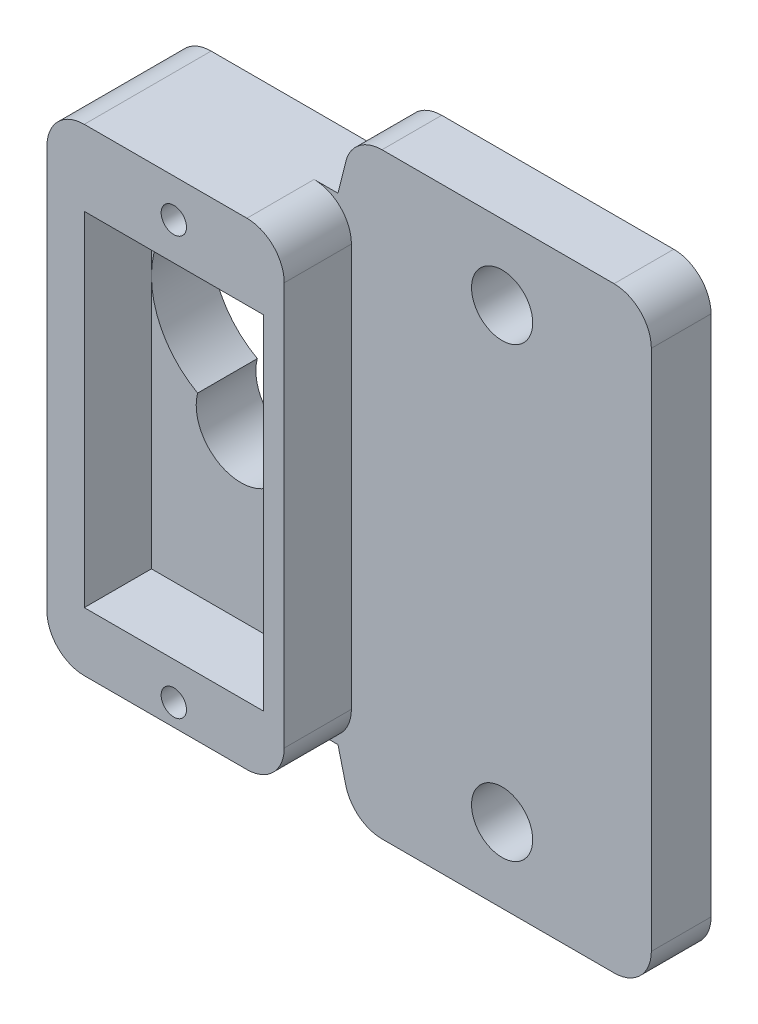
ISO-10303-21;
HEADER;
FILE_DESCRIPTION(('STEP AP214'),'2;1');
FILE_NAME('part.step','',(''),(''),'','','');
FILE_SCHEMA(('AUTOMOTIVE_DESIGN { 1 0 10303 214 1 1 1 1 }'));
ENDSEC;
DATA;
#1=APPLICATION_CONTEXT('core data for automotive mechanical design processes');
#2=APPLICATION_PROTOCOL_DEFINITION('international standard','automotive_design',2000,#1);
#3=PRODUCT_CONTEXT('',#1,'mechanical');
#4=PRODUCT('Part','Part','',(#3));
#5=PRODUCT_RELATED_PRODUCT_CATEGORY('part','',(#4));
#6=PRODUCT_DEFINITION_FORMATION('','',#4);
#7=PRODUCT_DEFINITION_CONTEXT('part definition',#1,'design');
#8=PRODUCT_DEFINITION('design','',#6,#7);
#9=PRODUCT_DEFINITION_SHAPE('','',#8);
#10=(LENGTH_UNIT() NAMED_UNIT(*) SI_UNIT(.MILLI.,.METRE.));
#11=(NAMED_UNIT(*) PLANE_ANGLE_UNIT() SI_UNIT($,.RADIAN.));
#12=(NAMED_UNIT(*) SI_UNIT($,.STERADIAN.) SOLID_ANGLE_UNIT());
#13=UNCERTAINTY_MEASURE_WITH_UNIT(LENGTH_MEASURE(1.E-05),#10,'distance_accuracy_value','');
#14=(GEOMETRIC_REPRESENTATION_CONTEXT(3) GLOBAL_UNCERTAINTY_ASSIGNED_CONTEXT((#13)) GLOBAL_UNIT_ASSIGNED_CONTEXT((#10,
#11,#12)) REPRESENTATION_CONTEXT('',''));
#15=CARTESIAN_POINT('',(0.,0.,0.));
#16=DIRECTION('',(0.,0.,1.));
#17=DIRECTION('',(1.,0.,0.));
#18=AXIS2_PLACEMENT_3D('',#15,#16,#17);
#19=CARTESIAN_POINT('',(0.,0.,4.));
#20=DIRECTION('',(0.,0.,1.));
#21=DIRECTION('',(1.,0.,0.));
#22=AXIS2_PLACEMENT_3D('',#19,#20,#21);
#23=PLANE('',#22);
#24=CARTESIAN_POINT('',(-7.5,4.95,4.));
#25=DIRECTION('',(0.,0.,1.));
#26=DIRECTION('',(1.,0.,0.));
#27=AXIS2_PLACEMENT_3D('',#24,#25,#26);
#28=CIRCLE('',#27,6.);
#29=CARTESIAN_POINT('',(-7.5,10.95,4.));
#30=VERTEX_POINT('',#29);
#31=CARTESIAN_POINT('',(-1.5,4.95,4.));
#32=VERTEX_POINT('',#31);
#33=EDGE_CURVE('E855',#30,#32,#28,.F.);
#34=ORIENTED_EDGE('',*,*,#33,.T.);
#35=DIRECTION('',(0.,1.,0.));
#36=VECTOR('',#35,1.);
#37=CARTESIAN_POINT('',(-1.5,0.,4.));
#38=LINE('',#37,#36);
#39=CARTESIAN_POINT('',(-1.5,10.95,4.));
#40=VERTEX_POINT('',#39);
#41=EDGE_CURVE('E326',#32,#40,#38,.T.);
#42=ORIENTED_EDGE('',*,*,#41,.T.);
#43=DIRECTION('',(-1.,0.,0.));
#44=VECTOR('',#43,1.);
#45=CARTESIAN_POINT('',(0.,10.95,4.));
#46=LINE('',#45,#44);
#47=EDGE_CURVE('E428',#40,#30,#46,.T.);
#48=ORIENTED_EDGE('',*,*,#47,.T.);
#49=EDGE_LOOP('',(#34,#42,#48));
#50=FACE_BOUND('',#49,.T.);
#51=ADVANCED_FACE('F37',(#50),#23,.T.);
#52=CARTESIAN_POINT('',(-13.5,4.95,4.));
#53=VERTEX_POINT('',#52);
#54=EDGE_CURVE('E255',#53,#30,#28,.F.);
#55=ORIENTED_EDGE('',*,*,#54,.T.);
#56=CARTESIAN_POINT('',(-13.5,10.95,4.));
#57=VERTEX_POINT('',#56);
#58=EDGE_CURVE('E447',#30,#57,#46,.T.);
#59=ORIENTED_EDGE('',*,*,#58,.T.);
#60=DIRECTION('',(0.,1.,0.));
#61=VECTOR('',#60,1.);
#62=CARTESIAN_POINT('',(-13.5,0.,4.));
#63=LINE('',#62,#61);
#64=EDGE_CURVE('E319',#53,#57,#63,.T.);
#65=ORIENTED_EDGE('',*,*,#64,.F.);
#66=EDGE_LOOP('',(#55,#59,#65));
#67=FACE_BOUND('',#66,.T.);
#68=ADVANCED_FACE('F509',(#67),#23,.T.);
#69=CARTESIAN_POINT('',(10.,-15.,4.));
#70=DIRECTION('',(0.,0.,1.));
#71=DIRECTION('',(1.,0.,0.));
#72=AXIS2_PLACEMENT_3D('',#69,#70,#71);
#73=CIRCLE('',#72,2.05);
#74=CARTESIAN_POINT('',(12.05,-15.,4.));
#75=VERTEX_POINT('',#74);
#76=EDGE_CURVE('E276',#75,#75,#73,.F.);
#77=ORIENTED_EDGE('',*,*,#76,.T.);
#78=EDGE_LOOP('',(#77));
#79=FACE_BOUND('',#78,.T.);
#80=CARTESIAN_POINT('',(10.,15.,4.));
#81=DIRECTION('',(0.,0.,1.));
#82=DIRECTION('',(1.,0.,0.));
#83=AXIS2_PLACEMENT_3D('',#80,#81,#82);
#84=CIRCLE('',#83,2.05);
#85=CARTESIAN_POINT('',(12.05,15.,4.));
#86=VERTEX_POINT('',#85);
#87=EDGE_CURVE('E273',#86,#86,#84,.T.);
#88=ORIENTED_EDGE('',*,*,#87,.F.);
#89=EDGE_LOOP('',(#88));
#90=FACE_BOUND('',#89,.T.);
#91=DIRECTION('',(1.,0.,0.));
#92=VECTOR('',#91,1.);
#93=CARTESIAN_POINT('',(0.,20.,4.));
#94=LINE('',#93,#92);
#95=CARTESIAN_POINT('',(1.95194101601104,20.,4.));
#96=VERTEX_POINT('',#95);
#97=CARTESIAN_POINT('',(17.5,20.,4.));
#98=VERTEX_POINT('',#97);
#99=EDGE_CURVE('E263',#96,#98,#94,.T.);
#100=ORIENTED_EDGE('',*,*,#99,.F.);
#101=CARTESIAN_POINT('',(1.95194101601104,17.5,4.));
#102=DIRECTION('',(0.,0.,1.));
#103=DIRECTION('',(1.,0.,0.));
#104=AXIS2_PLACEMENT_3D('',#101,#102,#103);
#105=CIRCLE('',#104,2.5);
#106=CARTESIAN_POINT('',(-0.47341523435229,18.1063390625908,4.));
#107=VERTEX_POINT('',#106);
#108=EDGE_CURVE('E349',#96,#107,#105,.T.);
#109=ORIENTED_EDGE('',*,*,#108,.T.);
#110=DIRECTION('',(-0.242535625036332,-0.970142500145332,0.));
#111=VECTOR('',#110,1.);
#112=CARTESIAN_POINT('',(-4.70588235294116,1.17647058823529,4.));
#113=LINE('',#112,#111);
#114=CARTESIAN_POINT('',(-0.999999999999996,16.,4.));
#115=VERTEX_POINT('',#114);
#116=EDGE_CURVE('E266',#107,#115,#113,.T.);
#117=ORIENTED_EDGE('',*,*,#116,.T.);
#118=DIRECTION('',(-1.,0.,0.));
#119=VECTOR('',#118,1.);
#120=CARTESIAN_POINT('',(0.,16.,4.));
#121=LINE('',#120,#119);
#122=CARTESIAN_POINT('',(-2.60000000000001,16.,4.));
#123=VERTEX_POINT('',#122);
#124=EDGE_CURVE('E268',#115,#123,#121,.T.);
#125=ORIENTED_EDGE('',*,*,#124,.T.);
#126=CARTESIAN_POINT('',(-2.6,13.5,4.));
#127=DIRECTION('',(0.,0.,1.));
#128=DIRECTION('',(1.,0.,0.));
#129=AXIS2_PLACEMENT_3D('',#126,#127,#128);
#130=CIRCLE('',#129,2.5);
#131=CARTESIAN_POINT('',(-0.100000000000005,13.5,4.));
#132=VERTEX_POINT('',#131);
#133=EDGE_CURVE('E410',#132,#123,#130,.T.);
#134=ORIENTED_EDGE('',*,*,#133,.F.);
#135=DIRECTION('',(0.,-1.,0.));
#136=VECTOR('',#135,1.);
#137=CARTESIAN_POINT('',(-0.100000000000003,0.,4.));
#138=LINE('',#137,#136);
#139=CARTESIAN_POINT('',(-0.100000000000001,-13.5,4.));
#140=VERTEX_POINT('',#139);
#141=EDGE_CURVE('E413',#132,#140,#138,.T.);
#142=ORIENTED_EDGE('',*,*,#141,.T.);
#143=CARTESIAN_POINT('',(-2.6,-13.5,4.));
#144=DIRECTION('',(0.,0.,1.));
#145=DIRECTION('',(1.,0.,0.));
#146=AXIS2_PLACEMENT_3D('',#143,#144,#145);
#147=CIRCLE('',#146,2.5);
#148=CARTESIAN_POINT('',(-2.6,-16.,4.));
#149=VERTEX_POINT('',#148);
#150=EDGE_CURVE('E233',#140,#149,#147,.F.);
#151=ORIENTED_EDGE('',*,*,#150,.T.);
#152=DIRECTION('',(-1.,0.,0.));
#153=VECTOR('',#152,1.);
#154=CARTESIAN_POINT('',(0.,-16.,4.));
#155=LINE('',#154,#153);
#156=CARTESIAN_POINT('',(-0.999999999999996,-16.,4.));
#157=VERTEX_POINT('',#156);
#158=EDGE_CURVE('E270',#157,#149,#155,.T.);
#159=ORIENTED_EDGE('',*,*,#158,.F.);
#160=DIRECTION('',(-0.242535625036332,0.970142500145332,0.));
#161=VECTOR('',#160,1.);
#162=CARTESIAN_POINT('',(-4.70588235294116,-1.17647058823529,4.));
#163=LINE('',#162,#161);
#164=CARTESIAN_POINT('',(-0.47341523435229,-18.1063390625908,4.));
#165=VERTEX_POINT('',#164);
#166=EDGE_CURVE('E254',#165,#157,#163,.T.);
#167=ORIENTED_EDGE('',*,*,#166,.F.);
#168=CARTESIAN_POINT('',(1.95194101601104,-17.5,4.));
#169=DIRECTION('',(0.,0.,1.));
#170=DIRECTION('',(1.,0.,0.));
#171=AXIS2_PLACEMENT_3D('',#168,#169,#170);
#172=CIRCLE('',#171,2.5);
#173=CARTESIAN_POINT('',(1.95194101601104,-20.,4.));
#174=VERTEX_POINT('',#173);
#175=EDGE_CURVE('E347',#165,#174,#172,.T.);
#176=ORIENTED_EDGE('',*,*,#175,.T.);
#177=DIRECTION('',(-1.,0.,0.));
#178=VECTOR('',#177,1.);
#179=CARTESIAN_POINT('',(0.,-20.,4.));
#180=LINE('',#179,#178);
#181=CARTESIAN_POINT('',(17.5,-20.,4.));
#182=VERTEX_POINT('',#181);
#183=EDGE_CURVE('E257',#182,#174,#180,.T.);
#184=ORIENTED_EDGE('',*,*,#183,.F.);
#185=CARTESIAN_POINT('',(17.5,-17.5,4.));
#186=DIRECTION('',(0.,0.,1.));
#187=DIRECTION('',(1.,0.,0.));
#188=AXIS2_PLACEMENT_3D('',#185,#186,#187);
#189=CIRCLE('',#188,2.5);
#190=CARTESIAN_POINT('',(20.,-17.5,4.));
#191=VERTEX_POINT('',#190);
#192=EDGE_CURVE('E343',#182,#191,#189,.T.);
#193=ORIENTED_EDGE('',*,*,#192,.T.);
#194=DIRECTION('',(0.,-1.,0.));
#195=VECTOR('',#194,1.);
#196=CARTESIAN_POINT('',(20.,0.,4.));
#197=LINE('',#196,#195);
#198=CARTESIAN_POINT('',(20.,17.5,4.));
#199=VERTEX_POINT('',#198);
#200=EDGE_CURVE('E260',#199,#191,#197,.T.);
#201=ORIENTED_EDGE('',*,*,#200,.F.);
#202=CARTESIAN_POINT('',(17.5,17.5,4.));
#203=DIRECTION('',(0.,0.,1.));
#204=DIRECTION('',(1.,0.,0.));
#205=AXIS2_PLACEMENT_3D('',#202,#203,#204);
#206=CIRCLE('',#205,2.5);
#207=EDGE_CURVE('E345',#199,#98,#206,.T.);
#208=ORIENTED_EDGE('',*,*,#207,.T.);
#209=EDGE_LOOP('',(#100,#109,#117,#125,#134,#142,#151,#159,#167,#176,#184,#193,#201,#208));
#210=FACE_BOUND('',#209,.T.);
#211=ADVANCED_FACE('F394',(#79,#90,#210),#23,.T.);
#212=CARTESIAN_POINT('',(-4.70588235294116,-1.17647058823529,4.));
#213=DIRECTION('',(-0.970142500145332,-0.242535625036332,0.));
#214=DIRECTION('',(0.242535625036332,-0.970142500145332,0.));
#215=AXIS2_PLACEMENT_3D('',#212,#213,#214);
#216=PLANE('',#215);
#217=DIRECTION('',(-0.242535625036332,0.970142500145332,0.));
#218=VECTOR('',#217,1.);
#219=CARTESIAN_POINT('',(-4.70588235294116,-1.17647058823529,0.));
#220=LINE('',#219,#218);
#221=CARTESIAN_POINT('',(-0.47341523435229,-18.1063390625908,0.));
#222=VERTEX_POINT('',#221);
#223=CARTESIAN_POINT('',(-0.999999999999996,-16.,0.));
#224=VERTEX_POINT('',#223);
#225=EDGE_CURVE('E287',#222,#224,#220,.T.);
#226=ORIENTED_EDGE('',*,*,#225,.F.);
#227=DIRECTION('',(0.,0.,-1.));
#228=VECTOR('',#227,1.);
#229=CARTESIAN_POINT('',(-0.473415234352291,-18.1063390625908,4.));
#230=LINE('',#229,#228);
#231=EDGE_CURVE('E356',#222,#165,#230,.F.);
#232=ORIENTED_EDGE('',*,*,#231,.T.);
#233=ORIENTED_EDGE('',*,*,#166,.T.);
#234=DIRECTION('',(0.,0.,-1.));
#235=VECTOR('',#234,1.);
#236=CARTESIAN_POINT('',(-0.999999999999996,-16.,4.));
#237=LINE('',#236,#235);
#238=EDGE_CURVE('E312',#157,#224,#237,.T.);
#239=ORIENTED_EDGE('',*,*,#238,.T.);
#240=EDGE_LOOP('',(#226,#232,#233,#239));
#241=FACE_BOUND('',#240,.T.);
#242=ADVANCED_FACE('F529',(#241),#216,.T.);
#243=CARTESIAN_POINT('',(0.,-20.,4.));
#244=DIRECTION('',(0.,-1.,0.));
#245=DIRECTION('',(0.,0.,-1.));
#246=AXIS2_PLACEMENT_3D('',#243,#244,#245);
#247=PLANE('',#246);
#248=ORIENTED_EDGE('',*,*,#183,.T.);
#249=DIRECTION('',(0.,0.,-1.));
#250=VECTOR('',#249,1.);
#251=CARTESIAN_POINT('',(1.95194101601104,-20.,4.));
#252=LINE('',#251,#250);
#253=CARTESIAN_POINT('',(1.95194101601104,-20.,0.));
#254=VERTEX_POINT('',#253);
#255=EDGE_CURVE('E353',#174,#254,#252,.T.);
#256=ORIENTED_EDGE('',*,*,#255,.T.);
#257=DIRECTION('',(-1.,0.,0.));
#258=VECTOR('',#257,1.);
#259=CARTESIAN_POINT('',(0.,-20.,0.));
#260=LINE('',#259,#258);
#261=CARTESIAN_POINT('',(17.5,-20.,0.));
#262=VERTEX_POINT('',#261);
#263=EDGE_CURVE('E289',#262,#254,#260,.T.);
#264=ORIENTED_EDGE('',*,*,#263,.F.);
#265=DIRECTION('',(0.,0.,-1.));
#266=VECTOR('',#265,1.);
#267=CARTESIAN_POINT('',(17.5,-20.,4.));
#268=LINE('',#267,#266);
#269=EDGE_CURVE('E351',#262,#182,#268,.F.);
#270=ORIENTED_EDGE('',*,*,#269,.T.);
#271=EDGE_LOOP('',(#248,#256,#264,#270));
#272=FACE_BOUND('',#271,.T.);
#273=ADVANCED_FACE('F534',(#272),#247,.T.);
#274=CARTESIAN_POINT('',(20.,0.,4.));
#275=DIRECTION('',(1.,0.,0.));
#276=DIRECTION('',(0.,0.,-1.));
#277=AXIS2_PLACEMENT_3D('',#274,#275,#276);
#278=PLANE('',#277);
#279=DIRECTION('',(0.,-1.,0.));
#280=VECTOR('',#279,1.);
#281=CARTESIAN_POINT('',(20.,0.,0.));
#282=LINE('',#281,#280);
#283=CARTESIAN_POINT('',(20.,17.5,0.));
#284=VERTEX_POINT('',#283);
#285=CARTESIAN_POINT('',(20.,-17.5,0.));
#286=VERTEX_POINT('',#285);
#287=EDGE_CURVE('E292',#284,#286,#282,.T.);
#288=ORIENTED_EDGE('',*,*,#287,.F.);
#289=DIRECTION('',(0.,0.,-1.));
#290=VECTOR('',#289,1.);
#291=CARTESIAN_POINT('',(20.,17.5,4.));
#292=LINE('',#291,#290);
#293=EDGE_CURVE('E11',#284,#199,#292,.F.);
#294=ORIENTED_EDGE('',*,*,#293,.T.);
#295=ORIENTED_EDGE('',*,*,#200,.T.);
#296=DIRECTION('',(0.,0.,-1.));
#297=VECTOR('',#296,1.);
#298=CARTESIAN_POINT('',(20.,-17.5,4.));
#299=LINE('',#298,#297);
#300=EDGE_CURVE('E45',#191,#286,#299,.T.);
#301=ORIENTED_EDGE('',*,*,#300,.T.);
#302=EDGE_LOOP('',(#288,#294,#295,#301));
#303=FACE_BOUND('',#302,.T.);
#304=ADVANCED_FACE('F373',(#303),#278,.T.);
#305=CARTESIAN_POINT('',(0.,20.,4.));
#306=DIRECTION('',(0.,1.,0.));
#307=DIRECTION('',(0.,0.,1.));
#308=AXIS2_PLACEMENT_3D('',#305,#306,#307);
#309=PLANE('',#308);
#310=DIRECTION('',(1.,0.,0.));
#311=VECTOR('',#310,1.);
#312=CARTESIAN_POINT('',(0.,20.,0.));
#313=LINE('',#312,#311);
#314=CARTESIAN_POINT('',(1.95194101601104,20.,0.));
#315=VERTEX_POINT('',#314);
#316=CARTESIAN_POINT('',(17.5,20.,0.));
#317=VERTEX_POINT('',#316);
#318=EDGE_CURVE('E295',#315,#317,#313,.T.);
#319=ORIENTED_EDGE('',*,*,#318,.F.);
#320=DIRECTION('',(0.,0.,-1.));
#321=VECTOR('',#320,1.);
#322=CARTESIAN_POINT('',(1.95194101601104,20.,4.));
#323=LINE('',#322,#321);
#324=EDGE_CURVE('E341',#315,#96,#323,.F.);
#325=ORIENTED_EDGE('',*,*,#324,.T.);
#326=ORIENTED_EDGE('',*,*,#99,.T.);
#327=DIRECTION('',(0.,0.,-1.));
#328=VECTOR('',#327,1.);
#329=CARTESIAN_POINT('',(17.5,20.,4.));
#330=LINE('',#329,#328);
#331=EDGE_CURVE('E338',#98,#317,#330,.T.);
#332=ORIENTED_EDGE('',*,*,#331,.T.);
#333=EDGE_LOOP('',(#319,#325,#326,#332));
#334=FACE_BOUND('',#333,.T.);
#335=ADVANCED_FACE('F389',(#334),#309,.T.);
#336=CARTESIAN_POINT('',(-4.70588235294116,1.17647058823529,4.));
#337=DIRECTION('',(0.970142500145332,-0.242535625036332,0.));
#338=DIRECTION('',(0.242535625036332,0.970142500145332,0.));
#339=AXIS2_PLACEMENT_3D('',#336,#337,#338);
#340=PLANE('',#339);
#341=ORIENTED_EDGE('',*,*,#116,.F.);
#342=DIRECTION('',(0.,0.,-1.));
#343=VECTOR('',#342,1.);
#344=CARTESIAN_POINT('',(-0.473415234352291,18.1063390625908,0.));
#345=LINE('',#344,#343);
#346=CARTESIAN_POINT('',(-0.47341523435229,18.1063390625908,0.));
#347=VERTEX_POINT('',#346);
#348=EDGE_CURVE('E322',#107,#347,#345,.T.);
#349=ORIENTED_EDGE('',*,*,#348,.T.);
#350=DIRECTION('',(-0.242535625036332,-0.970142500145332,0.));
#351=VECTOR('',#350,1.);
#352=CARTESIAN_POINT('',(-4.70588235294116,1.17647058823529,0.));
#353=LINE('',#352,#351);
#354=CARTESIAN_POINT('',(-0.999999999999996,16.,0.));
#355=VERTEX_POINT('',#354);
#356=EDGE_CURVE('E298',#347,#355,#353,.T.);
#357=ORIENTED_EDGE('',*,*,#356,.T.);
#358=DIRECTION('',(0.,0.,-1.));
#359=VECTOR('',#358,1.);
#360=CARTESIAN_POINT('',(-0.999999999999996,16.,4.));
#361=LINE('',#360,#359);
#362=EDGE_CURVE('E315',#115,#355,#361,.T.);
#363=ORIENTED_EDGE('',*,*,#362,.F.);
#364=EDGE_LOOP('',(#341,#349,#357,#363));
#365=FACE_BOUND('',#364,.T.);
#366=ADVANCED_FACE('F400',(#365),#340,.F.);
#367=CARTESIAN_POINT('',(0.,16.,4.));
#368=DIRECTION('',(0.,-1.,0.));
#369=DIRECTION('',(1.,0.,0.));
#370=AXIS2_PLACEMENT_3D('',#367,#368,#369);
#371=PLANE('',#370);
#372=DIRECTION('',(-1.,0.,0.));
#373=VECTOR('',#372,1.);
#374=CARTESIAN_POINT('',(0.,16.,0.));
#375=LINE('',#374,#373);
#376=CARTESIAN_POINT('',(-13.5,16.,0.));
#377=VERTEX_POINT('',#376);
#378=EDGE_CURVE('E300',#355,#377,#375,.T.);
#379=ORIENTED_EDGE('',*,*,#378,.T.);
#380=DIRECTION('',(0.,0.,-1.));
#381=VECTOR('',#380,1.);
#382=CARTESIAN_POINT('',(-13.5,16.,4.));
#383=LINE('',#382,#381);
#384=CARTESIAN_POINT('',(-13.5,16.,8.5));
#385=VERTEX_POINT('',#384);
#386=EDGE_CURVE('E52',#377,#385,#383,.F.);
#387=ORIENTED_EDGE('',*,*,#386,.T.);
#388=DIRECTION('',(-1.,0.,0.));
#389=VECTOR('',#388,1.);
#390=CARTESIAN_POINT('',(0.,16.,8.5));
#391=LINE('',#390,#389);
#392=CARTESIAN_POINT('',(-2.60000000000001,16.,8.5));
#393=VERTEX_POINT('',#392);
#394=EDGE_CURVE('E464',#393,#385,#391,.T.);
#395=ORIENTED_EDGE('',*,*,#394,.F.);
#396=DIRECTION('',(0.,0.,-1.));
#397=VECTOR('',#396,1.);
#398=CARTESIAN_POINT('',(-2.60000000000001,16.,8.5));
#399=LINE('',#398,#397);
#400=EDGE_CURVE('E408',#393,#123,#399,.T.);
#401=ORIENTED_EDGE('',*,*,#400,.T.);
#402=ORIENTED_EDGE('',*,*,#124,.F.);
#403=ORIENTED_EDGE('',*,*,#362,.T.);
#404=EDGE_LOOP('',(#379,#387,#395,#401,#402,#403));
#405=FACE_BOUND('',#404,.T.);
#406=ADVANCED_FACE('F405',(#405),#371,.F.);
#407=CARTESIAN_POINT('',(-16.,0.,4.));
#408=DIRECTION('',(1.,0.,0.));
#409=DIRECTION('',(0.,0.,-1.));
#410=AXIS2_PLACEMENT_3D('',#407,#408,#409);
#411=PLANE('',#410);
#412=DIRECTION('',(0.,-1.,0.));
#413=VECTOR('',#412,1.);
#414=CARTESIAN_POINT('',(-16.,0.,0.));
#415=LINE('',#414,#413);
#416=CARTESIAN_POINT('',(-16.,13.5,0.));
#417=VERTEX_POINT('',#416);
#418=CARTESIAN_POINT('',(-16.,-13.5,0.));
#419=VERTEX_POINT('',#418);
#420=EDGE_CURVE('E302',#417,#419,#415,.T.);
#421=ORIENTED_EDGE('',*,*,#420,.T.);
#422=DIRECTION('',(0.,0.,-1.));
#423=VECTOR('',#422,1.);
#424=CARTESIAN_POINT('',(-16.,-13.5,8.5));
#425=LINE('',#424,#423);
#426=CARTESIAN_POINT('',(-16.,-13.5,8.5));
#427=VERTEX_POINT('',#426);
#428=EDGE_CURVE('E60',#419,#427,#425,.F.);
#429=ORIENTED_EDGE('',*,*,#428,.T.);
#430=DIRECTION('',(0.,-1.,0.));
#431=VECTOR('',#430,1.);
#432=CARTESIAN_POINT('',(-16.,0.,8.5));
#433=LINE('',#432,#431);
#434=CARTESIAN_POINT('',(-16.,13.5,8.5));
#435=VERTEX_POINT('',#434);
#436=EDGE_CURVE('E462',#435,#427,#433,.T.);
#437=ORIENTED_EDGE('',*,*,#436,.F.);
#438=DIRECTION('',(0.,0.,-1.));
#439=VECTOR('',#438,1.);
#440=CARTESIAN_POINT('',(-16.,13.5,4.));
#441=LINE('',#440,#439);
#442=EDGE_CURVE('E361',#435,#417,#441,.T.);
#443=ORIENTED_EDGE('',*,*,#442,.T.);
#444=EDGE_LOOP('',(#421,#429,#437,#443));
#445=FACE_BOUND('',#444,.T.);
#446=ADVANCED_FACE('F557',(#445),#411,.F.);
#447=CARTESIAN_POINT('',(-7.5,-1.05,4.));
#448=DIRECTION('',(0.,0.,-1.));
#449=DIRECTION('',(-1.,0.,0.));
#450=AXIS2_PLACEMENT_3D('',#447,#448,#449);
#451=CYLINDRICAL_SURFACE('',#450,3.);
#452=CARTESIAN_POINT('',(-7.5,-1.05,0.));
#453=DIRECTION('',(0.,0.,1.));
#454=DIRECTION('',(1.,0.,0.));
#455=AXIS2_PLACEMENT_3D('',#452,#453,#454);
#456=CIRCLE('',#455,3.);
#457=CARTESIAN_POINT('',(-10.4047375096556,-0.300000000000001,0.));
#458=VERTEX_POINT('',#457);
#459=CARTESIAN_POINT('',(-4.59526249034443,-0.3,0.));
#460=VERTEX_POINT('',#459);
#461=EDGE_CURVE('E280',#458,#460,#456,.T.);
#462=ORIENTED_EDGE('',*,*,#461,.F.);
#463=DIRECTION('',(0.,0.,-1.));
#464=VECTOR('',#463,1.);
#465=CARTESIAN_POINT('',(-10.4047375096556,-0.300000000000001,4.));
#466=LINE('',#465,#464);
#467=CARTESIAN_POINT('',(-10.4047375096556,-0.300000000000001,4.));
#468=VERTEX_POINT('',#467);
#469=EDGE_CURVE('E316',#468,#458,#466,.T.);
#470=ORIENTED_EDGE('',*,*,#469,.F.);
#471=CARTESIAN_POINT('',(-7.5,-1.05,4.));
#472=DIRECTION('',(0.,0.,1.));
#473=DIRECTION('',(1.,0.,0.));
#474=AXIS2_PLACEMENT_3D('',#471,#472,#473);
#475=CIRCLE('',#474,3.);
#476=CARTESIAN_POINT('',(-4.59526249034443,-0.3,4.));
#477=VERTEX_POINT('',#476);
#478=EDGE_CURVE('E246',#468,#477,#475,.T.);
#479=ORIENTED_EDGE('',*,*,#478,.T.);
#480=DIRECTION('',(0.,0.,-1.));
#481=VECTOR('',#480,1.);
#482=CARTESIAN_POINT('',(-4.59526249034443,-0.3,4.));
#483=LINE('',#482,#481);
#484=EDGE_CURVE('E279',#477,#460,#483,.T.);
#485=ORIENTED_EDGE('',*,*,#484,.T.);
#486=EDGE_LOOP('',(#462,#470,#479,#485));
#487=FACE_BOUND('',#486,.T.);
#488=ADVANCED_FACE('F545',(#487),#451,.F.);
#489=CARTESIAN_POINT('',(10.,15.,4.));
#490=DIRECTION('',(0.,0.,-1.));
#491=DIRECTION('',(-1.,0.,0.));
#492=AXIS2_PLACEMENT_3D('',#489,#490,#491);
#493=CYLINDRICAL_SURFACE('',#492,2.05);
#494=ORIENTED_EDGE('',*,*,#87,.T.);
#495=EDGE_LOOP('',(#494));
#496=FACE_BOUND('',#495,.T.);
#497=CARTESIAN_POINT('',(10.,15.,0.));
#498=DIRECTION('',(0.,0.,1.));
#499=DIRECTION('',(1.,0.,0.));
#500=AXIS2_PLACEMENT_3D('',#497,#498,#499);
#501=CIRCLE('',#500,2.05);
#502=CARTESIAN_POINT('',(12.05,15.,0.));
#503=VERTEX_POINT('',#502);
#504=EDGE_CURVE('E307',#503,#503,#501,.T.);
#505=ORIENTED_EDGE('',*,*,#504,.F.);
#506=EDGE_LOOP('',(#505));
#507=FACE_BOUND('',#506,.T.);
#508=ADVANCED_FACE('F541',(#496,#507),#493,.F.);
#509=CARTESIAN_POINT('',(0.,-16.,4.));
#510=DIRECTION('',(0.,-1.,0.));
#511=DIRECTION('',(1.,0.,0.));
#512=AXIS2_PLACEMENT_3D('',#509,#510,#511);
#513=PLANE('',#512);
#514=DIRECTION('',(1.,0.,0.));
#515=VECTOR('',#514,1.);
#516=CARTESIAN_POINT('',(0.,-16.,8.5));
#517=LINE('',#516,#515);
#518=CARTESIAN_POINT('',(-13.5,-16.,8.5));
#519=VERTEX_POINT('',#518);
#520=CARTESIAN_POINT('',(-2.6,-16.,8.5));
#521=VERTEX_POINT('',#520);
#522=EDGE_CURVE('E460',#519,#521,#517,.T.);
#523=ORIENTED_EDGE('',*,*,#522,.F.);
#524=DIRECTION('',(0.,0.,-1.));
#525=VECTOR('',#524,1.);
#526=CARTESIAN_POINT('',(-13.5,-16.,0.));
#527=LINE('',#526,#525);
#528=CARTESIAN_POINT('',(-13.5,-16.,0.));
#529=VERTEX_POINT('',#528);
#530=EDGE_CURVE('E358',#519,#529,#527,.T.);
#531=ORIENTED_EDGE('',*,*,#530,.T.);
#532=DIRECTION('',(-1.,0.,0.));
#533=VECTOR('',#532,1.);
#534=CARTESIAN_POINT('',(0.,-16.,0.));
#535=LINE('',#534,#533);
#536=EDGE_CURVE('E304',#224,#529,#535,.T.);
#537=ORIENTED_EDGE('',*,*,#536,.F.);
#538=ORIENTED_EDGE('',*,*,#238,.F.);
#539=ORIENTED_EDGE('',*,*,#158,.T.);
#540=DIRECTION('',(0.,0.,-1.));
#541=VECTOR('',#540,1.);
#542=CARTESIAN_POINT('',(-2.6,-16.,8.5));
#543=LINE('',#542,#541);
#544=EDGE_CURVE('E240',#521,#149,#543,.T.);
#545=ORIENTED_EDGE('',*,*,#544,.F.);
#546=EDGE_LOOP('',(#523,#531,#537,#538,#539,#545));
#547=FACE_BOUND('',#546,.T.);
#548=ADVANCED_FACE('F544',(#547),#513,.T.);
#549=CARTESIAN_POINT('',(-7.5,4.95,4.));
#550=DIRECTION('',(0.,0.,-1.));
#551=DIRECTION('',(-1.,0.,0.));
#552=AXIS2_PLACEMENT_3D('',#549,#550,#551);
#553=CYLINDRICAL_SURFACE('',#552,6.);
#554=CARTESIAN_POINT('',(-7.5,4.95,0.));
#555=DIRECTION('',(0.,0.,1.));
#556=DIRECTION('',(1.,0.,0.));
#557=AXIS2_PLACEMENT_3D('',#554,#555,#556);
#558=CIRCLE('',#557,6.);
#559=EDGE_CURVE('E283',#458,#460,#558,.F.);
#560=ORIENTED_EDGE('',*,*,#559,.T.);
#561=ORIENTED_EDGE('',*,*,#484,.F.);
#562=EDGE_CURVE('E249',#32,#477,#28,.F.);
#563=ORIENTED_EDGE('',*,*,#562,.F.);
#564=ORIENTED_EDGE('',*,*,#33,.F.);
#565=ORIENTED_EDGE('',*,*,#54,.F.);
#566=EDGE_CURVE('E251',#468,#53,#28,.F.);
#567=ORIENTED_EDGE('',*,*,#566,.F.);
#568=ORIENTED_EDGE('',*,*,#469,.T.);
#569=EDGE_LOOP('',(#560,#561,#563,#564,#565,#567,#568));
#570=FACE_BOUND('',#569,.T.);
#571=ADVANCED_FACE('F525',(#570),#553,.F.);
#572=CARTESIAN_POINT('',(10.,-15.,4.));
#573=DIRECTION('',(0.,0.,-1.));
#574=DIRECTION('',(-1.,0.,0.));
#575=AXIS2_PLACEMENT_3D('',#572,#573,#574);
#576=CYLINDRICAL_SURFACE('',#575,2.05);
#577=ORIENTED_EDGE('',*,*,#76,.F.);
#578=EDGE_LOOP('',(#577));
#579=FACE_BOUND('',#578,.T.);
#580=CARTESIAN_POINT('',(10.,-15.,0.));
#581=DIRECTION('',(0.,0.,1.));
#582=DIRECTION('',(1.,0.,0.));
#583=AXIS2_PLACEMENT_3D('',#580,#581,#582);
#584=CIRCLE('',#583,2.05);
#585=CARTESIAN_POINT('',(12.05,-15.,0.));
#586=VERTEX_POINT('',#585);
#587=EDGE_CURVE('E250',#586,#586,#584,.F.);
#588=ORIENTED_EDGE('',*,*,#587,.T.);
#589=EDGE_LOOP('',(#588));
#590=FACE_BOUND('',#589,.T.);
#591=ADVANCED_FACE('F518',(#579,#590),#576,.F.);
#592=DIRECTION('',(-1.,0.,0.));
#593=VECTOR('',#592,1.);
#594=CARTESIAN_POINT('',(0.,-12.05,4.));
#595=LINE('',#594,#593);
#596=CARTESIAN_POINT('',(-1.5,-12.05,4.));
#597=VERTEX_POINT('',#596);
#598=CARTESIAN_POINT('',(-13.5,-12.05,4.));
#599=VERTEX_POINT('',#598);
#600=EDGE_CURVE('E236',#597,#599,#595,.T.);
#601=ORIENTED_EDGE('',*,*,#600,.F.);
#602=EDGE_CURVE('E426',#597,#32,#38,.T.);
#603=ORIENTED_EDGE('',*,*,#602,.T.);
#604=ORIENTED_EDGE('',*,*,#562,.T.);
#605=ORIENTED_EDGE('',*,*,#478,.F.);
#606=ORIENTED_EDGE('',*,*,#566,.T.);
#607=EDGE_CURVE('E451',#599,#53,#63,.T.);
#608=ORIENTED_EDGE('',*,*,#607,.F.);
#609=EDGE_LOOP('',(#601,#603,#604,#605,#606,#608));
#610=FACE_BOUND('',#609,.T.);
#611=ADVANCED_FACE('F511',(#610),#23,.T.);
#612=CARTESIAN_POINT('',(0.,0.,0.));
#613=DIRECTION('',(0.,0.,1.));
#614=DIRECTION('',(1.,0.,0.));
#615=AXIS2_PLACEMENT_3D('',#612,#613,#614);
#616=PLANE('',#615);
#617=ORIENTED_EDGE('',*,*,#461,.T.);
#618=ORIENTED_EDGE('',*,*,#559,.F.);
#619=EDGE_LOOP('',(#617,#618));
#620=FACE_BOUND('',#619,.T.);
#621=ORIENTED_EDGE('',*,*,#356,.F.);
#622=CARTESIAN_POINT('',(1.95194101601104,17.5,0.));
#623=DIRECTION('',(0.,0.,1.));
#624=DIRECTION('',(1.,0.,0.));
#625=AXIS2_PLACEMENT_3D('',#622,#623,#624);
#626=CIRCLE('',#625,2.5);
#627=EDGE_CURVE('E336',#347,#315,#626,.F.);
#628=ORIENTED_EDGE('',*,*,#627,.T.);
#629=ORIENTED_EDGE('',*,*,#318,.T.);
#630=CARTESIAN_POINT('',(17.5,17.5,0.));
#631=DIRECTION('',(0.,0.,1.));
#632=DIRECTION('',(1.,0.,0.));
#633=AXIS2_PLACEMENT_3D('',#630,#631,#632);
#634=CIRCLE('',#633,2.5);
#635=EDGE_CURVE('E328',#317,#284,#634,.F.);
#636=ORIENTED_EDGE('',*,*,#635,.T.);
#637=ORIENTED_EDGE('',*,*,#287,.T.);
#638=CARTESIAN_POINT('',(17.5,-17.5,0.));
#639=DIRECTION('',(0.,0.,1.));
#640=DIRECTION('',(1.,0.,0.));
#641=AXIS2_PLACEMENT_3D('',#638,#639,#640);
#642=CIRCLE('',#641,2.5);
#643=EDGE_CURVE('E325',#286,#262,#642,.F.);
#644=ORIENTED_EDGE('',*,*,#643,.T.);
#645=ORIENTED_EDGE('',*,*,#263,.T.);
#646=CARTESIAN_POINT('',(1.95194101601104,-17.5,0.));
#647=DIRECTION('',(0.,0.,1.));
#648=DIRECTION('',(1.,0.,0.));
#649=AXIS2_PLACEMENT_3D('',#646,#647,#648);
#650=CIRCLE('',#649,2.5);
#651=EDGE_CURVE('E334',#254,#222,#650,.F.);
#652=ORIENTED_EDGE('',*,*,#651,.T.);
#653=ORIENTED_EDGE('',*,*,#225,.T.);
#654=ORIENTED_EDGE('',*,*,#536,.T.);
#655=CARTESIAN_POINT('',(-13.5,-13.5,0.));
#656=DIRECTION('',(0.,0.,1.));
#657=DIRECTION('',(1.,0.,0.));
#658=AXIS2_PLACEMENT_3D('',#655,#656,#657);
#659=CIRCLE('',#658,2.5);
#660=EDGE_CURVE('E332',#529,#419,#659,.F.);
#661=ORIENTED_EDGE('',*,*,#660,.T.);
#662=ORIENTED_EDGE('',*,*,#420,.F.);
#663=CARTESIAN_POINT('',(-13.5,13.5,0.));
#664=DIRECTION('',(0.,0.,1.));
#665=DIRECTION('',(1.,0.,0.));
#666=AXIS2_PLACEMENT_3D('',#663,#664,#665);
#667=CIRCLE('',#666,2.5);
#668=EDGE_CURVE('E330',#417,#377,#667,.F.);
#669=ORIENTED_EDGE('',*,*,#668,.T.);
#670=ORIENTED_EDGE('',*,*,#378,.F.);
#671=EDGE_LOOP('',(#621,#628,#629,#636,#637,#644,#645,#652,#653,#654,#661,#662,#669,#670));
#672=FACE_BOUND('',#671,.T.);
#673=ORIENTED_EDGE('',*,*,#504,.T.);
#674=EDGE_LOOP('',(#673));
#675=FACE_BOUND('',#674,.T.);
#676=ORIENTED_EDGE('',*,*,#587,.F.);
#677=EDGE_LOOP('',(#676));
#678=FACE_BOUND('',#677,.T.);
#679=ADVANCED_FACE('F380',(#620,#672,#675,#678),#616,.F.);
#680=CARTESIAN_POINT('',(-0.100000000000003,0.,8.5));
#681=DIRECTION('',(1.,0.,0.));
#682=DIRECTION('',(0.,1.,0.));
#683=AXIS2_PLACEMENT_3D('',#680,#681,#682);
#684=PLANE('',#683);
#685=ORIENTED_EDGE('',*,*,#141,.F.);
#686=DIRECTION('',(0.,0.,-1.));
#687=VECTOR('',#686,1.);
#688=CARTESIAN_POINT('',(-0.100000000000005,13.5,8.5));
#689=LINE('',#688,#687);
#690=CARTESIAN_POINT('',(-0.100000000000005,13.5,8.5));
#691=VERTEX_POINT('',#690);
#692=EDGE_CURVE('E284',#691,#132,#689,.T.);
#693=ORIENTED_EDGE('',*,*,#692,.F.);
#694=DIRECTION('',(0.,-1.,0.));
#695=VECTOR('',#694,1.);
#696=CARTESIAN_POINT('',(-0.100000000000003,0.,8.5));
#697=LINE('',#696,#695);
#698=CARTESIAN_POINT('',(-0.100000000000001,-13.5,8.5));
#699=VERTEX_POINT('',#698);
#700=EDGE_CURVE('E467',#691,#699,#697,.T.);
#701=ORIENTED_EDGE('',*,*,#700,.T.);
#702=DIRECTION('',(0.,0.,-1.));
#703=VECTOR('',#702,1.);
#704=CARTESIAN_POINT('',(-0.100000000000001,-13.5,8.5));
#705=LINE('',#704,#703);
#706=EDGE_CURVE('E237',#699,#140,#705,.T.);
#707=ORIENTED_EDGE('',*,*,#706,.T.);
#708=EDGE_LOOP('',(#685,#693,#701,#707));
#709=FACE_BOUND('',#708,.T.);
#710=ADVANCED_FACE('F424',(#709),#684,.T.);
#711=CARTESIAN_POINT('',(-2.6,13.5,8.5));
#712=DIRECTION('',(0.,0.,-1.));
#713=DIRECTION('',(-1.,0.,0.));
#714=AXIS2_PLACEMENT_3D('',#711,#712,#713);
#715=CYLINDRICAL_SURFACE('',#714,2.5);
#716=ORIENTED_EDGE('',*,*,#133,.T.);
#717=ORIENTED_EDGE('',*,*,#400,.F.);
#718=CARTESIAN_POINT('',(-2.6,13.5,8.5));
#719=DIRECTION('',(0.,0.,1.));
#720=DIRECTION('',(1.,0.,0.));
#721=AXIS2_PLACEMENT_3D('',#718,#719,#720);
#722=CIRCLE('',#721,2.5);
#723=EDGE_CURVE('E419',#691,#393,#722,.T.);
#724=ORIENTED_EDGE('',*,*,#723,.F.);
#725=ORIENTED_EDGE('',*,*,#692,.T.);
#726=EDGE_LOOP('',(#716,#717,#724,#725));
#727=FACE_BOUND('',#726,.T.);
#728=ADVANCED_FACE('F417',(#727),#715,.T.);
#729=CARTESIAN_POINT('',(0.,-12.05,8.5));
#730=DIRECTION('',(0.,-1.,0.));
#731=DIRECTION('',(0.,0.,-1.));
#732=AXIS2_PLACEMENT_3D('',#729,#730,#731);
#733=PLANE('',#732);
#734=ORIENTED_EDGE('',*,*,#600,.T.);
#735=DIRECTION('',(0.,0.,-1.));
#736=VECTOR('',#735,1.);
#737=CARTESIAN_POINT('',(-13.5,-12.05,8.5));
#738=LINE('',#737,#736);
#739=CARTESIAN_POINT('',(-13.5,-12.05,8.5));
#740=VERTEX_POINT('',#739);
#741=EDGE_CURVE('E214',#740,#599,#738,.T.);
#742=ORIENTED_EDGE('',*,*,#741,.F.);
#743=DIRECTION('',(-1.,0.,0.));
#744=VECTOR('',#743,1.);
#745=CARTESIAN_POINT('',(0.,-12.05,8.5));
#746=LINE('',#745,#744);
#747=CARTESIAN_POINT('',(-1.5,-12.05,8.5));
#748=VERTEX_POINT('',#747);
#749=EDGE_CURVE('E223',#748,#740,#746,.T.);
#750=ORIENTED_EDGE('',*,*,#749,.F.);
#751=DIRECTION('',(0.,0.,-1.));
#752=VECTOR('',#751,1.);
#753=CARTESIAN_POINT('',(-1.5,-12.05,8.5));
#754=LINE('',#753,#752);
#755=EDGE_CURVE('E436',#748,#597,#754,.T.);
#756=ORIENTED_EDGE('',*,*,#755,.T.);
#757=EDGE_LOOP('',(#734,#742,#750,#756));
#758=FACE_BOUND('',#757,.T.);
#759=ADVANCED_FACE('F235',(#758),#733,.F.);
#760=CARTESIAN_POINT('',(-13.5,0.,8.5));
#761=DIRECTION('',(-1.,0.,0.));
#762=DIRECTION('',(0.,0.,1.));
#763=AXIS2_PLACEMENT_3D('',#760,#761,#762);
#764=PLANE('',#763);
#765=ORIENTED_EDGE('',*,*,#607,.T.);
#766=ORIENTED_EDGE('',*,*,#64,.T.);
#767=DIRECTION('',(0.,0.,-1.));
#768=VECTOR('',#767,1.);
#769=CARTESIAN_POINT('',(-13.5,10.95,8.5));
#770=LINE('',#769,#768);
#771=CARTESIAN_POINT('',(-13.5,10.95,8.5));
#772=VERTEX_POINT('',#771);
#773=EDGE_CURVE('E218',#772,#57,#770,.T.);
#774=ORIENTED_EDGE('',*,*,#773,.F.);
#775=DIRECTION('',(0.,1.,0.));
#776=VECTOR('',#775,1.);
#777=CARTESIAN_POINT('',(-13.5,0.,8.5));
#778=LINE('',#777,#776);
#779=EDGE_CURVE('E209',#740,#772,#778,.T.);
#780=ORIENTED_EDGE('',*,*,#779,.F.);
#781=ORIENTED_EDGE('',*,*,#741,.T.);
#782=EDGE_LOOP('',(#765,#766,#774,#780,#781));
#783=FACE_BOUND('',#782,.T.);
#784=ADVANCED_FACE('F212',(#783),#764,.F.);
#785=CARTESIAN_POINT('',(0.,10.95,8.5));
#786=DIRECTION('',(0.,-1.,0.));
#787=DIRECTION('',(0.,0.,-1.));
#788=AXIS2_PLACEMENT_3D('',#785,#786,#787);
#789=PLANE('',#788);
#790=ORIENTED_EDGE('',*,*,#47,.F.);
#791=DIRECTION('',(0.,0.,-1.));
#792=VECTOR('',#791,1.);
#793=CARTESIAN_POINT('',(-1.5,10.95,8.5));
#794=LINE('',#793,#792);
#795=CARTESIAN_POINT('',(-1.5,10.95,8.5));
#796=VERTEX_POINT('',#795);
#797=EDGE_CURVE('E242',#796,#40,#794,.T.);
#798=ORIENTED_EDGE('',*,*,#797,.F.);
#799=DIRECTION('',(-1.,0.,0.));
#800=VECTOR('',#799,1.);
#801=CARTESIAN_POINT('',(0.,10.95,8.5));
#802=LINE('',#801,#800);
#803=EDGE_CURVE('E222',#796,#772,#802,.T.);
#804=ORIENTED_EDGE('',*,*,#803,.T.);
#805=ORIENTED_EDGE('',*,*,#773,.T.);
#806=ORIENTED_EDGE('',*,*,#58,.F.);
#807=EDGE_LOOP('',(#790,#798,#804,#805,#806));
#808=FACE_BOUND('',#807,.T.);
#809=ADVANCED_FACE('F446',(#808),#789,.T.);
#810=CARTESIAN_POINT('',(-1.5,0.,8.5));
#811=DIRECTION('',(-1.,0.,0.));
#812=DIRECTION('',(0.,0.,1.));
#813=AXIS2_PLACEMENT_3D('',#810,#811,#812);
#814=PLANE('',#813);
#815=ORIENTED_EDGE('',*,*,#602,.F.);
#816=ORIENTED_EDGE('',*,*,#755,.F.);
#817=DIRECTION('',(0.,1.,0.));
#818=VECTOR('',#817,1.);
#819=CARTESIAN_POINT('',(-1.5,0.,8.5));
#820=LINE('',#819,#818);
#821=EDGE_CURVE('E230',#748,#796,#820,.T.);
#822=ORIENTED_EDGE('',*,*,#821,.T.);
#823=ORIENTED_EDGE('',*,*,#797,.T.);
#824=ORIENTED_EDGE('',*,*,#41,.F.);
#825=EDGE_LOOP('',(#815,#816,#822,#823,#824));
#826=FACE_BOUND('',#825,.T.);
#827=ADVANCED_FACE('F443',(#826),#814,.T.);
#828=CARTESIAN_POINT('',(-2.6,-13.5,8.5));
#829=DIRECTION('',(0.,0.,-1.));
#830=DIRECTION('',(-1.,0.,0.));
#831=AXIS2_PLACEMENT_3D('',#828,#829,#830);
#832=CYLINDRICAL_SURFACE('',#831,2.5);
#833=ORIENTED_EDGE('',*,*,#150,.F.);
#834=ORIENTED_EDGE('',*,*,#706,.F.);
#835=CARTESIAN_POINT('',(-2.6,-13.5,8.5));
#836=DIRECTION('',(0.,0.,1.));
#837=DIRECTION('',(1.,0.,0.));
#838=AXIS2_PLACEMENT_3D('',#835,#836,#837);
#839=CIRCLE('',#838,2.5);
#840=EDGE_CURVE('E437',#699,#521,#839,.F.);
#841=ORIENTED_EDGE('',*,*,#840,.T.);
#842=ORIENTED_EDGE('',*,*,#544,.T.);
#843=EDGE_LOOP('',(#833,#834,#841,#842));
#844=FACE_BOUND('',#843,.T.);
#845=ADVANCED_FACE('F495',(#844),#832,.T.);
#846=CARTESIAN_POINT('',(0.,0.,8.5));
#847=DIRECTION('',(0.,0.,1.));
#848=DIRECTION('',(1.,0.,0.));
#849=AXIS2_PLACEMENT_3D('',#846,#847,#848);
#850=PLANE('',#849);
#851=CARTESIAN_POINT('',(-7.5,13.45,8.5));
#852=DIRECTION('',(0.,0.,1.));
#853=DIRECTION('',(1.,0.,0.));
#854=AXIS2_PLACEMENT_3D('',#851,#852,#853);
#855=CIRCLE('',#854,0.85);
#856=CARTESIAN_POINT('',(-6.65,13.45,8.5));
#857=VERTEX_POINT('',#856);
#858=EDGE_CURVE('E477',#857,#857,#855,.T.);
#859=ORIENTED_EDGE('',*,*,#858,.F.);
#860=EDGE_LOOP('',(#859));
#861=FACE_BOUND('',#860,.T.);
#862=CARTESIAN_POINT('',(-7.5,-14.55,8.5));
#863=DIRECTION('',(0.,0.,1.));
#864=DIRECTION('',(1.,0.,0.));
#865=AXIS2_PLACEMENT_3D('',#862,#863,#864);
#866=CIRCLE('',#865,0.85);
#867=CARTESIAN_POINT('',(-6.65,-14.55,8.5));
#868=VERTEX_POINT('',#867);
#869=EDGE_CURVE('E474',#868,#868,#866,.T.);
#870=ORIENTED_EDGE('',*,*,#869,.F.);
#871=EDGE_LOOP('',(#870));
#872=FACE_BOUND('',#871,.T.);
#873=ORIENTED_EDGE('',*,*,#749,.T.);
#874=ORIENTED_EDGE('',*,*,#779,.T.);
#875=ORIENTED_EDGE('',*,*,#803,.F.);
#876=ORIENTED_EDGE('',*,*,#821,.F.);
#877=EDGE_LOOP('',(#873,#874,#875,#876));
#878=FACE_BOUND('',#877,.T.);
#879=ORIENTED_EDGE('',*,*,#436,.T.);
#880=CARTESIAN_POINT('',(-13.5,-13.5,8.5));
#881=DIRECTION('',(0.,0.,1.));
#882=DIRECTION('',(1.,0.,0.));
#883=AXIS2_PLACEMENT_3D('',#880,#881,#882);
#884=CIRCLE('',#883,2.5);
#885=EDGE_CURVE('E367',#427,#519,#884,.T.);
#886=ORIENTED_EDGE('',*,*,#885,.T.);
#887=ORIENTED_EDGE('',*,*,#522,.T.);
#888=ORIENTED_EDGE('',*,*,#840,.F.);
#889=ORIENTED_EDGE('',*,*,#700,.F.);
#890=ORIENTED_EDGE('',*,*,#723,.T.);
#891=ORIENTED_EDGE('',*,*,#394,.T.);
#892=CARTESIAN_POINT('',(-13.5,13.5,8.5));
#893=DIRECTION('',(0.,0.,1.));
#894=DIRECTION('',(1.,0.,0.));
#895=AXIS2_PLACEMENT_3D('',#892,#893,#894);
#896=CIRCLE('',#895,2.5);
#897=EDGE_CURVE('E365',#385,#435,#896,.T.);
#898=ORIENTED_EDGE('',*,*,#897,.T.);
#899=EDGE_LOOP('',(#879,#886,#887,#888,#889,#890,#891,#898));
#900=FACE_BOUND('',#899,.T.);
#901=ADVANCED_FACE('F227',(#861,#872,#878,#900),#850,.T.);
#902=CARTESIAN_POINT('',(-7.5,-14.55,0.5));
#903=DIRECTION('',(0.,0.,1.));
#904=DIRECTION('',(1.,0.,0.));
#905=AXIS2_PLACEMENT_3D('',#902,#903,#904);
#906=CYLINDRICAL_SURFACE('',#905,0.85);
#907=CARTESIAN_POINT('',(-7.5,-14.55,0.5));
#908=DIRECTION('',(0.,0.,1.));
#909=DIRECTION('',(1.,0.,0.));
#910=AXIS2_PLACEMENT_3D('',#907,#908,#909);
#911=CIRCLE('',#910,0.85);
#912=CARTESIAN_POINT('',(-6.65,-14.55,0.5));
#913=VERTEX_POINT('',#912);
#914=EDGE_CURVE('E471',#913,#913,#911,.T.);
#915=ORIENTED_EDGE('',*,*,#914,.F.);
#916=EDGE_LOOP('',(#915));
#917=FACE_BOUND('',#916,.T.);
#918=ORIENTED_EDGE('',*,*,#869,.T.);
#919=EDGE_LOOP('',(#918));
#920=FACE_BOUND('',#919,.T.);
#921=ADVANCED_FACE('F494',(#917,#920),#906,.F.);
#922=CARTESIAN_POINT('',(-7.5,-14.55,0.5));
#923=DIRECTION('',(0.,0.,1.));
#924=DIRECTION('',(1.,0.,0.));
#925=AXIS2_PLACEMENT_3D('',#922,#923,#924);
#926=PLANE('',#925);
#927=ORIENTED_EDGE('',*,*,#914,.T.);
#928=EDGE_LOOP('',(#927));
#929=FACE_BOUND('',#928,.T.);
#930=ADVANCED_FACE('F488',(#929),#926,.T.);
#931=CARTESIAN_POINT('',(-7.5,13.45,0.5));
#932=DIRECTION('',(0.,0.,1.));
#933=DIRECTION('',(1.,0.,0.));
#934=AXIS2_PLACEMENT_3D('',#931,#932,#933);
#935=CYLINDRICAL_SURFACE('',#934,0.85);
#936=CARTESIAN_POINT('',(-7.5,13.45,0.5));
#937=DIRECTION('',(0.,0.,1.));
#938=DIRECTION('',(1.,0.,0.));
#939=AXIS2_PLACEMENT_3D('',#936,#937,#938);
#940=CIRCLE('',#939,0.85);
#941=CARTESIAN_POINT('',(-6.65,13.45,0.5));
#942=VERTEX_POINT('',#941);
#943=EDGE_CURVE('E457',#942,#942,#940,.T.);
#944=ORIENTED_EDGE('',*,*,#943,.F.);
#945=EDGE_LOOP('',(#944));
#946=FACE_BOUND('',#945,.T.);
#947=ORIENTED_EDGE('',*,*,#858,.T.);
#948=EDGE_LOOP('',(#947));
#949=FACE_BOUND('',#948,.T.);
#950=ADVANCED_FACE('F485',(#946,#949),#935,.F.);
#951=CARTESIAN_POINT('',(-7.5,13.45,0.5));
#952=DIRECTION('',(0.,0.,1.));
#953=DIRECTION('',(1.,0.,0.));
#954=AXIS2_PLACEMENT_3D('',#951,#952,#953);
#955=PLANE('',#954);
#956=ORIENTED_EDGE('',*,*,#943,.T.);
#957=EDGE_LOOP('',(#956));
#958=FACE_BOUND('',#957,.T.);
#959=ADVANCED_FACE('F483',(#958),#955,.T.);
#960=CARTESIAN_POINT('',(1.95194101601104,17.5,4.));
#961=DIRECTION('',(0.,0.,1.));
#962=DIRECTION('',(1.,0.,0.));
#963=AXIS2_PLACEMENT_3D('',#960,#961,#962);
#964=CYLINDRICAL_SURFACE('',#963,2.5);
#965=ORIENTED_EDGE('',*,*,#108,.F.);
#966=ORIENTED_EDGE('',*,*,#324,.F.);
#967=ORIENTED_EDGE('',*,*,#627,.F.);
#968=ORIENTED_EDGE('',*,*,#348,.F.);
#969=EDGE_LOOP('',(#965,#966,#967,#968));
#970=FACE_BOUND('',#969,.T.);
#971=ADVANCED_FACE('F398',(#970),#964,.T.);
#972=CARTESIAN_POINT('',(1.95194101601104,-17.5,4.));
#973=DIRECTION('',(0.,0.,-1.));
#974=DIRECTION('',(-1.,0.,0.));
#975=AXIS2_PLACEMENT_3D('',#972,#973,#974);
#976=CYLINDRICAL_SURFACE('',#975,2.5);
#977=ORIENTED_EDGE('',*,*,#175,.F.);
#978=ORIENTED_EDGE('',*,*,#231,.F.);
#979=ORIENTED_EDGE('',*,*,#651,.F.);
#980=ORIENTED_EDGE('',*,*,#255,.F.);
#981=EDGE_LOOP('',(#977,#978,#979,#980));
#982=FACE_BOUND('',#981,.T.);
#983=ADVANCED_FACE('F579',(#982),#976,.T.);
#984=CARTESIAN_POINT('',(-13.5,-13.5,4.));
#985=DIRECTION('',(0.,0.,1.));
#986=DIRECTION('',(1.,0.,0.));
#987=AXIS2_PLACEMENT_3D('',#984,#985,#986);
#988=CYLINDRICAL_SURFACE('',#987,2.5);
#989=ORIENTED_EDGE('',*,*,#885,.F.);
#990=ORIENTED_EDGE('',*,*,#428,.F.);
#991=ORIENTED_EDGE('',*,*,#660,.F.);
#992=ORIENTED_EDGE('',*,*,#530,.F.);
#993=EDGE_LOOP('',(#989,#990,#991,#992));
#994=FACE_BOUND('',#993,.T.);
#995=ADVANCED_FACE('F582',(#994),#988,.T.);
#996=CARTESIAN_POINT('',(-13.5,13.5,4.));
#997=DIRECTION('',(0.,0.,-1.));
#998=DIRECTION('',(-1.,0.,0.));
#999=AXIS2_PLACEMENT_3D('',#996,#997,#998);
#1000=CYLINDRICAL_SURFACE('',#999,2.5);
#1001=ORIENTED_EDGE('',*,*,#897,.F.);
#1002=ORIENTED_EDGE('',*,*,#386,.F.);
#1003=ORIENTED_EDGE('',*,*,#668,.F.);
#1004=ORIENTED_EDGE('',*,*,#442,.F.);
#1005=EDGE_LOOP('',(#1001,#1002,#1003,#1004));
#1006=FACE_BOUND('',#1005,.T.);
#1007=ADVANCED_FACE('F586',(#1006),#1000,.T.);
#1008=CARTESIAN_POINT('',(17.5,17.5,4.));
#1009=DIRECTION('',(0.,0.,-1.));
#1010=DIRECTION('',(-1.,0.,0.));
#1011=AXIS2_PLACEMENT_3D('',#1008,#1009,#1010);
#1012=CYLINDRICAL_SURFACE('',#1011,2.5);
#1013=ORIENTED_EDGE('',*,*,#207,.F.);
#1014=ORIENTED_EDGE('',*,*,#293,.F.);
#1015=ORIENTED_EDGE('',*,*,#635,.F.);
#1016=ORIENTED_EDGE('',*,*,#331,.F.);
#1017=EDGE_LOOP('',(#1013,#1014,#1015,#1016));
#1018=FACE_BOUND('',#1017,.T.);
#1019=ADVANCED_FACE('F387',(#1018),#1012,.T.);
#1020=CARTESIAN_POINT('',(17.5,-17.5,4.));
#1021=DIRECTION('',(0.,0.,-1.));
#1022=DIRECTION('',(-1.,0.,0.));
#1023=AXIS2_PLACEMENT_3D('',#1020,#1021,#1022);
#1024=CYLINDRICAL_SURFACE('',#1023,2.5);
#1025=ORIENTED_EDGE('',*,*,#192,.F.);
#1026=ORIENTED_EDGE('',*,*,#269,.F.);
#1027=ORIENTED_EDGE('',*,*,#643,.F.);
#1028=ORIENTED_EDGE('',*,*,#300,.F.);
#1029=EDGE_LOOP('',(#1025,#1026,#1027,#1028));
#1030=FACE_BOUND('',#1029,.T.);
#1031=ADVANCED_FACE('F39',(#1030),#1024,.T.);
#1032=CLOSED_SHELL('',(#51,#68,#211,#242,#273,#304,#335,#366,#406,#446,#488,#508,#548,#571,#591,
#611,#679,#710,#728,#759,#784,#809,#827,#845,#901,#921,#930,#950,#959,#971,#983,#995,#1007,
#1019,#1031));
#1033=MANIFOLD_SOLID_BREP('B2',#1032);
#1034=ADVANCED_BREP_SHAPE_REPRESENTATION('',(#18,#1033),#14);
#1035=SHAPE_DEFINITION_REPRESENTATION(#9,#1034);
ENDSEC;
END-ISO-10303-21;
